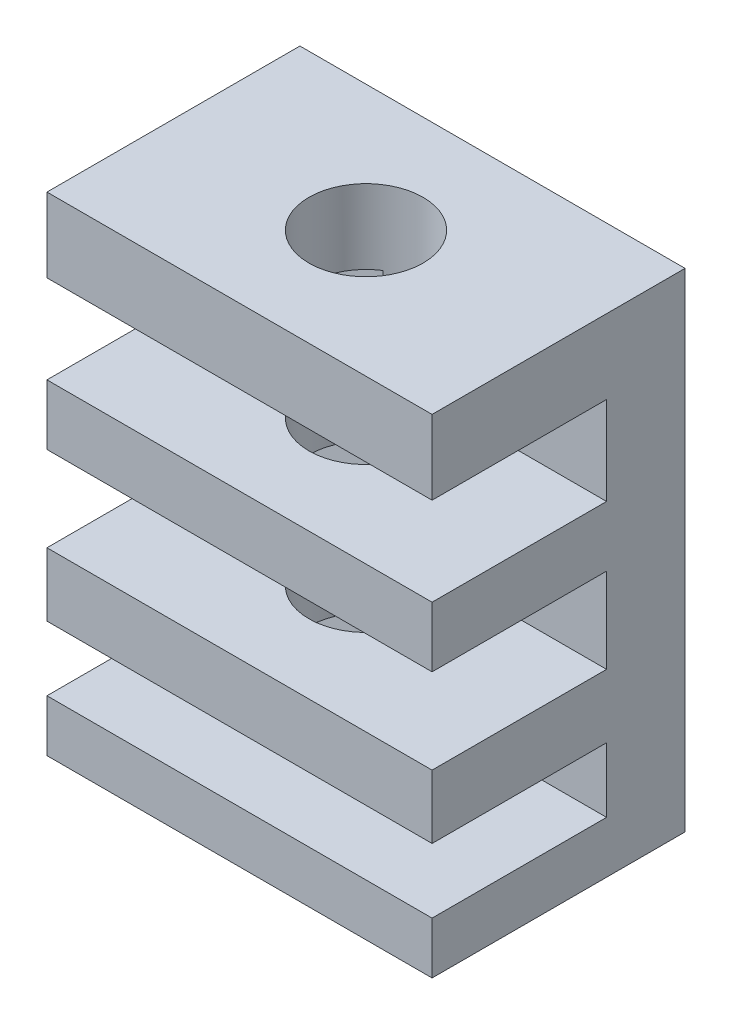
ISO-10303-21;
HEADER;
FILE_DESCRIPTION(('STEP AP214'),'2;1');
FILE_NAME('part.step','',(''),(''),'','','');
FILE_SCHEMA(('AUTOMOTIVE_DESIGN { 1 0 10303 214 1 1 1 1 }'));
ENDSEC;
DATA;
#1=APPLICATION_CONTEXT('core data for automotive mechanical design processes');
#2=APPLICATION_PROTOCOL_DEFINITION('international standard','automotive_design',2000,#1);
#3=PRODUCT_CONTEXT('',#1,'mechanical');
#4=PRODUCT('Part','Part','',(#3));
#5=PRODUCT_RELATED_PRODUCT_CATEGORY('part','',(#4));
#6=PRODUCT_DEFINITION_FORMATION('','',#4);
#7=PRODUCT_DEFINITION_CONTEXT('part definition',#1,'design');
#8=PRODUCT_DEFINITION('design','',#6,#7);
#9=PRODUCT_DEFINITION_SHAPE('','',#8);
#10=(LENGTH_UNIT() NAMED_UNIT(*) SI_UNIT(.MILLI.,.METRE.));
#11=(NAMED_UNIT(*) PLANE_ANGLE_UNIT() SI_UNIT($,.RADIAN.));
#12=(NAMED_UNIT(*) SI_UNIT($,.STERADIAN.) SOLID_ANGLE_UNIT());
#13=UNCERTAINTY_MEASURE_WITH_UNIT(LENGTH_MEASURE(1.E-05),#10,'distance_accuracy_value','');
#14=(GEOMETRIC_REPRESENTATION_CONTEXT(3) GLOBAL_UNCERTAINTY_ASSIGNED_CONTEXT((#13)) GLOBAL_UNIT_ASSIGNED_CONTEXT((#10,
#11,#12)) REPRESENTATION_CONTEXT('',''));
#15=CARTESIAN_POINT('',(0.,0.,0.));
#16=DIRECTION('',(0.,0.,1.));
#17=DIRECTION('',(1.,0.,0.));
#18=AXIS2_PLACEMENT_3D('',#15,#16,#17);
#19=CARTESIAN_POINT('',(20.,21.4882723581472,4.07517189736783));
#20=DIRECTION('',(0.,0.,-1.));
#21=DIRECTION('',(-1.,0.,0.));
#22=AXIS2_PLACEMENT_3D('',#19,#20,#21);
#23=PLANE('',#22);
#24=DIRECTION('',(-1.,0.,0.));
#25=VECTOR('',#24,1.);
#26=CARTESIAN_POINT('',(20.,16.9015751979846,4.07517189736783));
#27=LINE('',#26,#25);
#28=CARTESIAN_POINT('',(8.40046132815094,16.9015751979846,4.07517189736783));
#29=VERTEX_POINT('',#28);
#30=CARTESIAN_POINT('',(0.,16.9015751979846,4.07517189736783));
#31=VERTEX_POINT('',#30);
#32=EDGE_CURVE('E232',#29,#31,#27,.T.);
#33=ORIENTED_EDGE('',*,*,#32,.F.);
#34=DIRECTION('',(0.,1.,0.));
#35=VECTOR('',#34,1.);
#36=CARTESIAN_POINT('',(8.40046132815094,0.,4.07517189736783));
#37=LINE('',#36,#35);
#38=CARTESIAN_POINT('',(8.40046132815094,21.4882723581472,4.07517189736783));
#39=VERTEX_POINT('',#38);
#40=EDGE_CURVE('E48',#29,#39,#37,.T.);
#41=ORIENTED_EDGE('',*,*,#40,.T.);
#42=DIRECTION('',(-1.,0.,0.));
#43=VECTOR('',#42,1.);
#44=CARTESIAN_POINT('',(20.,21.4882723581472,4.07517189736783));
#45=LINE('',#44,#43);
#46=CARTESIAN_POINT('',(0.,21.4882723581472,4.07517189736783));
#47=VERTEX_POINT('',#46);
#48=EDGE_CURVE('E236',#39,#47,#45,.T.);
#49=ORIENTED_EDGE('',*,*,#48,.T.);
#50=DIRECTION('',(0.,-1.,0.));
#51=VECTOR('',#50,1.);
#52=CARTESIAN_POINT('',(0.,21.4882723581472,4.07517189736783));
#53=LINE('',#52,#51);
#54=EDGE_CURVE('E283',#47,#31,#53,.T.);
#55=ORIENTED_EDGE('',*,*,#54,.T.);
#56=EDGE_LOOP('',(#33,#41,#49,#55));
#57=FACE_BOUND('',#56,.T.);
#58=ADVANCED_FACE('F33',(#57),#23,.F.);
#59=CARTESIAN_POINT('',(20.,13.7691966495809,4.07517189736783));
#60=DIRECTION('',(0.,0.,-1.));
#61=DIRECTION('',(-1.,0.,0.));
#62=AXIS2_PLACEMENT_3D('',#59,#60,#61);
#63=PLANE('',#62);
#64=DIRECTION('',(-1.,0.,0.));
#65=VECTOR('',#64,1.);
#66=CARTESIAN_POINT('',(20.,9.35030548308285,4.07517189736783));
#67=LINE('',#66,#65);
#68=CARTESIAN_POINT('',(8.40046132815094,9.35030548308285,4.07517189736783));
#69=VERTEX_POINT('',#68);
#70=CARTESIAN_POINT('',(0.,9.35030548308285,4.07517189736783));
#71=VERTEX_POINT('',#70);
#72=EDGE_CURVE('E218',#69,#71,#67,.T.);
#73=ORIENTED_EDGE('',*,*,#72,.F.);
#74=DIRECTION('',(0.,1.,0.));
#75=VECTOR('',#74,1.);
#76=CARTESIAN_POINT('',(8.40046132815094,0.,4.07517189736783));
#77=LINE('',#76,#75);
#78=CARTESIAN_POINT('',(8.40046132815094,13.7691966495809,4.07517189736783));
#79=VERTEX_POINT('',#78);
#80=EDGE_CURVE('E56',#69,#79,#77,.T.);
#81=ORIENTED_EDGE('',*,*,#80,.T.);
#82=DIRECTION('',(-1.,0.,0.));
#83=VECTOR('',#82,1.);
#84=CARTESIAN_POINT('',(20.,13.7691966495809,4.07517189736783));
#85=LINE('',#84,#83);
#86=CARTESIAN_POINT('',(0.,13.7691966495809,4.07517189736783));
#87=VERTEX_POINT('',#86);
#88=EDGE_CURVE('E222',#79,#87,#85,.T.);
#89=ORIENTED_EDGE('',*,*,#88,.T.);
#90=DIRECTION('',(0.,-1.,0.));
#91=VECTOR('',#90,1.);
#92=CARTESIAN_POINT('',(0.,13.7691966495809,4.07517189736783));
#93=LINE('',#92,#91);
#94=EDGE_CURVE('E293',#87,#71,#93,.T.);
#95=ORIENTED_EDGE('',*,*,#94,.T.);
#96=EDGE_LOOP('',(#73,#81,#89,#95));
#97=FACE_BOUND('',#96,.T.);
#98=ADVANCED_FACE('F442',(#97),#63,.F.);
#99=CARTESIAN_POINT('',(20.,6.05012094101468,4.07517189736783));
#100=DIRECTION('',(0.,0.,-1.));
#101=DIRECTION('',(-1.,0.,0.));
#102=AXIS2_PLACEMENT_3D('',#99,#100,#101);
#103=PLANE('',#102);
#104=DIRECTION('',(-1.,0.,0.));
#105=VECTOR('',#104,1.);
#106=CARTESIAN_POINT('',(20.,2.69400106772501,4.07517189736783));
#107=LINE('',#106,#105);
#108=CARTESIAN_POINT('',(8.40046132815094,2.69400106772501,4.07517189736783));
#109=VERTEX_POINT('',#108);
#110=CARTESIAN_POINT('',(0.,2.69400106772501,4.07517189736783));
#111=VERTEX_POINT('',#110);
#112=EDGE_CURVE('E205',#109,#111,#107,.T.);
#113=ORIENTED_EDGE('',*,*,#112,.F.);
#114=DIRECTION('',(0.,1.,0.));
#115=VECTOR('',#114,1.);
#116=CARTESIAN_POINT('',(8.40046132815094,0.,4.07517189736783));
#117=LINE('',#116,#115);
#118=CARTESIAN_POINT('',(8.40046132815094,6.05012094101468,4.07517189736783));
#119=VERTEX_POINT('',#118);
#120=EDGE_CURVE('E186',#109,#119,#117,.T.);
#121=ORIENTED_EDGE('',*,*,#120,.T.);
#122=DIRECTION('',(-1.,0.,0.));
#123=VECTOR('',#122,1.);
#124=CARTESIAN_POINT('',(20.,6.05012094101468,4.07517189736783));
#125=LINE('',#124,#123);
#126=CARTESIAN_POINT('',(0.,6.05012094101468,4.07517189736783));
#127=VERTEX_POINT('',#126);
#128=EDGE_CURVE('E204',#119,#127,#125,.T.);
#129=ORIENTED_EDGE('',*,*,#128,.T.);
#130=DIRECTION('',(0.,-1.,0.));
#131=VECTOR('',#130,1.);
#132=CARTESIAN_POINT('',(0.,6.05012094101468,4.07517189736783));
#133=LINE('',#132,#131);
#134=EDGE_CURVE('E303',#127,#111,#133,.T.);
#135=ORIENTED_EDGE('',*,*,#134,.T.);
#136=EDGE_LOOP('',(#113,#121,#129,#135));
#137=FACE_BOUND('',#136,.T.);
#138=ADVANCED_FACE('F427',(#137),#103,.F.);
#139=CARTESIAN_POINT('',(20.,0.,13.1366955552499));
#140=DIRECTION('',(0.,1.,0.));
#141=DIRECTION('',(0.,0.,1.));
#142=AXIS2_PLACEMENT_3D('',#139,#140,#141);
#143=PLANE('',#142);
#144=CARTESIAN_POINT('',(10.,0.,6.56834777762497));
#145=DIRECTION('',(0.,1.,0.));
#146=DIRECTION('',(0.,0.,1.));
#147=AXIS2_PLACEMENT_3D('',#144,#145,#146);
#148=CIRCLE('',#147,2.96216980145241);
#149=CARTESIAN_POINT('',(10.,0.,9.53051757907738));
#150=VERTEX_POINT('',#149);
#151=EDGE_CURVE('E199',#150,#150,#148,.T.);
#152=ORIENTED_EDGE('',*,*,#151,.T.);
#153=EDGE_LOOP('',(#152));
#154=FACE_BOUND('',#153,.T.);
#155=DIRECTION('',(0.,0.,-1.));
#156=VECTOR('',#155,1.);
#157=CARTESIAN_POINT('',(0.,0.,13.1366955552499));
#158=LINE('',#157,#156);
#159=CARTESIAN_POINT('',(0.,0.,13.1366955552499));
#160=VERTEX_POINT('',#159);
#161=CARTESIAN_POINT('',(0.,0.,0.));
#162=VERTEX_POINT('',#161);
#163=EDGE_CURVE('E261',#160,#162,#158,.T.);
#164=ORIENTED_EDGE('',*,*,#163,.T.);
#165=DIRECTION('',(-1.,0.,0.));
#166=VECTOR('',#165,1.);
#167=CARTESIAN_POINT('',(20.,0.,0.));
#168=LINE('',#167,#166);
#169=CARTESIAN_POINT('',(20.,0.,0.));
#170=VERTEX_POINT('',#169);
#171=EDGE_CURVE('E41',#170,#162,#168,.T.);
#172=ORIENTED_EDGE('',*,*,#171,.F.);
#173=DIRECTION('',(0.,0.,-1.));
#174=VECTOR('',#173,1.);
#175=CARTESIAN_POINT('',(20.,0.,13.1366955552499));
#176=LINE('',#175,#174);
#177=CARTESIAN_POINT('',(20.,0.,13.1366955552499));
#178=VERTEX_POINT('',#177);
#179=EDGE_CURVE('E309',#178,#170,#176,.T.);
#180=ORIENTED_EDGE('',*,*,#179,.F.);
#181=DIRECTION('',(-1.,0.,0.));
#182=VECTOR('',#181,1.);
#183=CARTESIAN_POINT('',(20.,0.,13.1366955552499));
#184=LINE('',#183,#182);
#185=EDGE_CURVE('E263',#178,#160,#184,.T.);
#186=ORIENTED_EDGE('',*,*,#185,.T.);
#187=EDGE_LOOP('',(#164,#172,#180,#186));
#188=FACE_BOUND('',#187,.T.);
#189=ADVANCED_FACE('F35',(#154,#188),#143,.F.);
#190=CARTESIAN_POINT('',(20.,0.,0.));
#191=DIRECTION('',(0.,0.,1.));
#192=DIRECTION('',(1.,0.,0.));
#193=AXIS2_PLACEMENT_3D('',#190,#191,#192);
#194=PLANE('',#193);
#195=DIRECTION('',(0.,1.,0.));
#196=VECTOR('',#195,1.);
#197=CARTESIAN_POINT('',(0.,0.,0.));
#198=LINE('',#197,#196);
#199=CARTESIAN_POINT('',(0.,25.3478102124303,0.));
#200=VERTEX_POINT('',#199);
#201=EDGE_CURVE('E254',#162,#200,#198,.T.);
#202=ORIENTED_EDGE('',*,*,#201,.T.);
#203=DIRECTION('',(-1.,0.,0.));
#204=VECTOR('',#203,1.);
#205=CARTESIAN_POINT('',(20.,25.3478102124303,0.));
#206=LINE('',#205,#204);
#207=CARTESIAN_POINT('',(20.,25.3478102124303,0.));
#208=VERTEX_POINT('',#207);
#209=EDGE_CURVE('E246',#208,#200,#206,.T.);
#210=ORIENTED_EDGE('',*,*,#209,.F.);
#211=DIRECTION('',(0.,1.,0.));
#212=VECTOR('',#211,1.);
#213=CARTESIAN_POINT('',(20.,0.,0.));
#214=LINE('',#213,#212);
#215=EDGE_CURVE('E255',#170,#208,#214,.T.);
#216=ORIENTED_EDGE('',*,*,#215,.F.);
#217=ORIENTED_EDGE('',*,*,#171,.T.);
#218=EDGE_LOOP('',(#202,#210,#216,#217));
#219=FACE_BOUND('',#218,.T.);
#220=ADVANCED_FACE('F252',(#219),#194,.F.);
#221=CARTESIAN_POINT('',(20.,25.3478102124303,0.));
#222=DIRECTION('',(0.,-1.,0.));
#223=DIRECTION('',(0.,0.,-1.));
#224=AXIS2_PLACEMENT_3D('',#221,#222,#223);
#225=PLANE('',#224);
#226=CARTESIAN_POINT('',(10.,25.3478102124303,6.56834777762497));
#227=DIRECTION('',(0.,-1.,0.));
#228=DIRECTION('',(0.,0.,-1.));
#229=AXIS2_PLACEMENT_3D('',#226,#227,#228);
#230=CIRCLE('',#229,2.96216980145241);
#231=CARTESIAN_POINT('',(10.,25.3478102124303,3.60617797617256));
#232=VERTEX_POINT('',#231);
#233=EDGE_CURVE('E266',#232,#232,#230,.T.);
#234=ORIENTED_EDGE('',*,*,#233,.T.);
#235=EDGE_LOOP('',(#234));
#236=FACE_BOUND('',#235,.T.);
#237=DIRECTION('',(0.,0.,1.));
#238=VECTOR('',#237,1.);
#239=CARTESIAN_POINT('',(0.,25.3478102124303,0.));
#240=LINE('',#239,#238);
#241=CARTESIAN_POINT('',(0.,25.3478102124303,13.1366955552499));
#242=VERTEX_POINT('',#241);
#243=EDGE_CURVE('E268',#200,#242,#240,.T.);
#244=ORIENTED_EDGE('',*,*,#243,.T.);
#245=DIRECTION('',(-1.,0.,0.));
#246=VECTOR('',#245,1.);
#247=CARTESIAN_POINT('',(20.,25.3478102124303,13.1366955552499));
#248=LINE('',#247,#246);
#249=CARTESIAN_POINT('',(20.,25.3478102124303,13.1366955552499));
#250=VERTEX_POINT('',#249);
#251=EDGE_CURVE('E243',#250,#242,#248,.T.);
#252=ORIENTED_EDGE('',*,*,#251,.F.);
#253=DIRECTION('',(0.,0.,1.));
#254=VECTOR('',#253,1.);
#255=CARTESIAN_POINT('',(20.,25.3478102124303,0.));
#256=LINE('',#255,#254);
#257=EDGE_CURVE('E336',#208,#250,#256,.T.);
#258=ORIENTED_EDGE('',*,*,#257,.F.);
#259=ORIENTED_EDGE('',*,*,#209,.T.);
#260=EDGE_LOOP('',(#244,#252,#258,#259));
#261=FACE_BOUND('',#260,.T.);
#262=ADVANCED_FACE('F369',(#236,#261),#225,.F.);
#263=CARTESIAN_POINT('',(20.,25.3478102124303,13.1366955552499));
#264=DIRECTION('',(0.,0.,-1.));
#265=DIRECTION('',(-1.,0.,0.));
#266=AXIS2_PLACEMENT_3D('',#263,#264,#265);
#267=PLANE('',#266);
#268=DIRECTION('',(0.,-1.,0.));
#269=VECTOR('',#268,1.);
#270=CARTESIAN_POINT('',(0.,25.3478102124303,13.1366955552499));
#271=LINE('',#270,#269);
#272=CARTESIAN_POINT('',(0.,21.4882723581472,13.1366955552499));
#273=VERTEX_POINT('',#272);
#274=EDGE_CURVE('E278',#242,#273,#271,.T.);
#275=ORIENTED_EDGE('',*,*,#274,.T.);
#276=DIRECTION('',(-1.,0.,0.));
#277=VECTOR('',#276,1.);
#278=CARTESIAN_POINT('',(20.,21.4882723581472,13.1366955552499));
#279=LINE('',#278,#277);
#280=CARTESIAN_POINT('',(20.,21.4882723581472,13.1366955552499));
#281=VERTEX_POINT('',#280);
#282=EDGE_CURVE('E240',#281,#273,#279,.T.);
#283=ORIENTED_EDGE('',*,*,#282,.F.);
#284=DIRECTION('',(0.,-1.,0.));
#285=VECTOR('',#284,1.);
#286=CARTESIAN_POINT('',(20.,25.3478102124303,13.1366955552499));
#287=LINE('',#286,#285);
#288=EDGE_CURVE('E334',#250,#281,#287,.T.);
#289=ORIENTED_EDGE('',*,*,#288,.F.);
#290=ORIENTED_EDGE('',*,*,#251,.T.);
#291=EDGE_LOOP('',(#275,#283,#289,#290));
#292=FACE_BOUND('',#291,.T.);
#293=ADVANCED_FACE('F372',(#292),#267,.F.);
#294=CARTESIAN_POINT('',(20.,21.4882723581472,13.1366955552499));
#295=DIRECTION('',(0.,1.,0.));
#296=DIRECTION('',(0.,0.,1.));
#297=AXIS2_PLACEMENT_3D('',#294,#295,#296);
#298=PLANE('',#297);
#299=ORIENTED_EDGE('',*,*,#48,.F.);
#300=CARTESIAN_POINT('',(10.,21.4882723581472,6.56834777762497));
#301=DIRECTION('',(0.,1.,0.));
#302=DIRECTION('',(0.,0.,1.));
#303=AXIS2_PLACEMENT_3D('',#300,#301,#302);
#304=CIRCLE('',#303,2.96216980145241);
#305=CARTESIAN_POINT('',(11.5995386718491,21.4882723581472,4.07517189736783));
#306=VERTEX_POINT('',#305);
#307=EDGE_CURVE('E271',#39,#306,#304,.T.);
#308=ORIENTED_EDGE('',*,*,#307,.T.);
#309=CARTESIAN_POINT('',(20.,21.4882723581472,4.07517189736783));
#310=VERTEX_POINT('',#309);
#311=EDGE_CURVE('E237',#310,#306,#45,.T.);
#312=ORIENTED_EDGE('',*,*,#311,.F.);
#313=DIRECTION('',(0.,0.,-1.));
#314=VECTOR('',#313,1.);
#315=CARTESIAN_POINT('',(20.,21.4882723581472,13.1366955552499));
#316=LINE('',#315,#314);
#317=EDGE_CURVE('E332',#281,#310,#316,.T.);
#318=ORIENTED_EDGE('',*,*,#317,.F.);
#319=ORIENTED_EDGE('',*,*,#282,.T.);
#320=DIRECTION('',(0.,0.,-1.));
#321=VECTOR('',#320,1.);
#322=CARTESIAN_POINT('',(0.,21.4882723581472,13.1366955552499));
#323=LINE('',#322,#321);
#324=EDGE_CURVE('E280',#273,#47,#323,.T.);
#325=ORIENTED_EDGE('',*,*,#324,.T.);
#326=EDGE_LOOP('',(#299,#308,#312,#318,#319,#325));
#327=FACE_BOUND('',#326,.T.);
#328=ADVANCED_FACE('F386',(#327),#298,.F.);
#329=ORIENTED_EDGE('',*,*,#311,.T.);
#330=DIRECTION('',(0.,1.,0.));
#331=VECTOR('',#330,1.);
#332=CARTESIAN_POINT('',(11.5995386718491,0.,4.07517189736783));
#333=LINE('',#332,#331);
#334=CARTESIAN_POINT('',(11.5995386718491,16.9015751979846,4.07517189736783));
#335=VERTEX_POINT('',#334);
#336=EDGE_CURVE('E343',#306,#335,#333,.F.);
#337=ORIENTED_EDGE('',*,*,#336,.T.);
#338=CARTESIAN_POINT('',(20.,16.9015751979846,4.07517189736783));
#339=VERTEX_POINT('',#338);
#340=EDGE_CURVE('E233',#339,#335,#27,.T.);
#341=ORIENTED_EDGE('',*,*,#340,.F.);
#342=DIRECTION('',(0.,-1.,0.));
#343=VECTOR('',#342,1.);
#344=CARTESIAN_POINT('',(20.,21.4882723581472,4.07517189736783));
#345=LINE('',#344,#343);
#346=EDGE_CURVE('E330',#310,#339,#345,.T.);
#347=ORIENTED_EDGE('',*,*,#346,.F.);
#348=EDGE_LOOP('',(#329,#337,#341,#347));
#349=FACE_BOUND('',#348,.T.);
#350=ADVANCED_FACE('F395',(#349),#23,.F.);
#351=CARTESIAN_POINT('',(20.,16.9015751979846,4.07517189736783));
#352=DIRECTION('',(0.,-1.,0.));
#353=DIRECTION('',(0.,0.,-1.));
#354=AXIS2_PLACEMENT_3D('',#351,#352,#353);
#355=PLANE('',#354);
#356=ORIENTED_EDGE('',*,*,#340,.T.);
#357=CARTESIAN_POINT('',(10.,16.9015751979846,6.56834777762497));
#358=DIRECTION('',(0.,-1.,0.));
#359=DIRECTION('',(0.,0.,-1.));
#360=AXIS2_PLACEMENT_3D('',#357,#358,#359);
#361=CIRCLE('',#360,2.96216980145241);
#362=EDGE_CURVE('E346',#335,#29,#361,.T.);
#363=ORIENTED_EDGE('',*,*,#362,.T.);
#364=ORIENTED_EDGE('',*,*,#32,.T.);
#365=DIRECTION('',(0.,0.,1.));
#366=VECTOR('',#365,1.);
#367=CARTESIAN_POINT('',(0.,16.9015751979846,4.07517189736783));
#368=LINE('',#367,#366);
#369=CARTESIAN_POINT('',(0.,16.9015751979846,13.1366955552499));
#370=VERTEX_POINT('',#369);
#371=EDGE_CURVE('E286',#31,#370,#368,.T.);
#372=ORIENTED_EDGE('',*,*,#371,.T.);
#373=DIRECTION('',(-1.,0.,0.));
#374=VECTOR('',#373,1.);
#375=CARTESIAN_POINT('',(20.,16.9015751979846,13.1366955552499));
#376=LINE('',#375,#374);
#377=CARTESIAN_POINT('',(20.,16.9015751979846,13.1366955552499));
#378=VERTEX_POINT('',#377);
#379=EDGE_CURVE('E229',#378,#370,#376,.T.);
#380=ORIENTED_EDGE('',*,*,#379,.F.);
#381=DIRECTION('',(0.,0.,1.));
#382=VECTOR('',#381,1.);
#383=CARTESIAN_POINT('',(20.,16.9015751979846,4.07517189736783));
#384=LINE('',#383,#382);
#385=EDGE_CURVE('E328',#339,#378,#384,.T.);
#386=ORIENTED_EDGE('',*,*,#385,.F.);
#387=EDGE_LOOP('',(#356,#363,#364,#372,#380,#386));
#388=FACE_BOUND('',#387,.T.);
#389=ADVANCED_FACE('F397',(#388),#355,.F.);
#390=CARTESIAN_POINT('',(20.,16.9015751979846,13.1366955552499));
#391=DIRECTION('',(0.,0.,-1.));
#392=DIRECTION('',(-1.,0.,0.));
#393=AXIS2_PLACEMENT_3D('',#390,#391,#392);
#394=PLANE('',#393);
#395=DIRECTION('',(0.,-1.,0.));
#396=VECTOR('',#395,1.);
#397=CARTESIAN_POINT('',(0.,16.9015751979846,13.1366955552499));
#398=LINE('',#397,#396);
#399=CARTESIAN_POINT('',(0.,13.7691966495809,13.1366955552499));
#400=VERTEX_POINT('',#399);
#401=EDGE_CURVE('E288',#370,#400,#398,.T.);
#402=ORIENTED_EDGE('',*,*,#401,.T.);
#403=DIRECTION('',(-1.,0.,0.));
#404=VECTOR('',#403,1.);
#405=CARTESIAN_POINT('',(20.,13.7691966495809,13.1366955552499));
#406=LINE('',#405,#404);
#407=CARTESIAN_POINT('',(20.,13.7691966495809,13.1366955552499));
#408=VERTEX_POINT('',#407);
#409=EDGE_CURVE('E226',#408,#400,#406,.T.);
#410=ORIENTED_EDGE('',*,*,#409,.F.);
#411=DIRECTION('',(0.,-1.,0.));
#412=VECTOR('',#411,1.);
#413=CARTESIAN_POINT('',(20.,16.9015751979846,13.1366955552499));
#414=LINE('',#413,#412);
#415=EDGE_CURVE('E326',#378,#408,#414,.T.);
#416=ORIENTED_EDGE('',*,*,#415,.F.);
#417=ORIENTED_EDGE('',*,*,#379,.T.);
#418=EDGE_LOOP('',(#402,#410,#416,#417));
#419=FACE_BOUND('',#418,.T.);
#420=ADVANCED_FACE('F402',(#419),#394,.F.);
#421=CARTESIAN_POINT('',(20.,13.7691966495809,13.1366955552499));
#422=DIRECTION('',(0.,1.,0.));
#423=DIRECTION('',(0.,0.,1.));
#424=AXIS2_PLACEMENT_3D('',#421,#422,#423);
#425=PLANE('',#424);
#426=ORIENTED_EDGE('',*,*,#88,.F.);
#427=CARTESIAN_POINT('',(10.,13.7691966495809,6.56834777762497));
#428=DIRECTION('',(0.,1.,0.));
#429=DIRECTION('',(0.,0.,1.));
#430=AXIS2_PLACEMENT_3D('',#427,#428,#429);
#431=CIRCLE('',#430,2.96216980145241);
#432=CARTESIAN_POINT('',(11.5995386718491,13.7691966495809,4.07517189736783));
#433=VERTEX_POINT('',#432);
#434=EDGE_CURVE('E348',#79,#433,#431,.T.);
#435=ORIENTED_EDGE('',*,*,#434,.T.);
#436=CARTESIAN_POINT('',(20.,13.7691966495809,4.07517189736783));
#437=VERTEX_POINT('',#436);
#438=EDGE_CURVE('E223',#437,#433,#85,.T.);
#439=ORIENTED_EDGE('',*,*,#438,.F.);
#440=DIRECTION('',(0.,0.,-1.));
#441=VECTOR('',#440,1.);
#442=CARTESIAN_POINT('',(20.,13.7691966495809,13.1366955552499));
#443=LINE('',#442,#441);
#444=EDGE_CURVE('E324',#408,#437,#443,.T.);
#445=ORIENTED_EDGE('',*,*,#444,.F.);
#446=ORIENTED_EDGE('',*,*,#409,.T.);
#447=DIRECTION('',(0.,0.,-1.));
#448=VECTOR('',#447,1.);
#449=CARTESIAN_POINT('',(0.,13.7691966495809,13.1366955552499));
#450=LINE('',#449,#448);
#451=EDGE_CURVE('E290',#400,#87,#450,.T.);
#452=ORIENTED_EDGE('',*,*,#451,.T.);
#453=EDGE_LOOP('',(#426,#435,#439,#445,#446,#452));
#454=FACE_BOUND('',#453,.T.);
#455=ADVANCED_FACE('F409',(#454),#425,.F.);
#456=ORIENTED_EDGE('',*,*,#438,.T.);
#457=DIRECTION('',(0.,1.,0.));
#458=VECTOR('',#457,1.);
#459=CARTESIAN_POINT('',(11.5995386718491,0.,4.07517189736783));
#460=LINE('',#459,#458);
#461=CARTESIAN_POINT('',(11.5995386718491,9.35030548308285,4.07517189736783));
#462=VERTEX_POINT('',#461);
#463=EDGE_CURVE('E352',#433,#462,#460,.F.);
#464=ORIENTED_EDGE('',*,*,#463,.T.);
#465=CARTESIAN_POINT('',(20.,9.35030548308285,4.07517189736783));
#466=VERTEX_POINT('',#465);
#467=EDGE_CURVE('E219',#466,#462,#67,.T.);
#468=ORIENTED_EDGE('',*,*,#467,.F.);
#469=DIRECTION('',(0.,-1.,0.));
#470=VECTOR('',#469,1.);
#471=CARTESIAN_POINT('',(20.,13.7691966495809,4.07517189736783));
#472=LINE('',#471,#470);
#473=EDGE_CURVE('E322',#437,#466,#472,.T.);
#474=ORIENTED_EDGE('',*,*,#473,.F.);
#475=EDGE_LOOP('',(#456,#464,#468,#474));
#476=FACE_BOUND('',#475,.T.);
#477=ADVANCED_FACE('F411',(#476),#63,.F.);
#478=CARTESIAN_POINT('',(20.,9.35030548308285,4.07517189736783));
#479=DIRECTION('',(0.,-1.,0.));
#480=DIRECTION('',(0.,0.,-1.));
#481=AXIS2_PLACEMENT_3D('',#478,#479,#480);
#482=PLANE('',#481);
#483=ORIENTED_EDGE('',*,*,#467,.T.);
#484=CARTESIAN_POINT('',(10.,9.35030548308285,6.56834777762497));
#485=DIRECTION('',(0.,-1.,0.));
#486=DIRECTION('',(0.,0.,-1.));
#487=AXIS2_PLACEMENT_3D('',#484,#485,#486);
#488=CIRCLE('',#487,2.96216980145241);
#489=EDGE_CURVE('E355',#462,#69,#488,.T.);
#490=ORIENTED_EDGE('',*,*,#489,.T.);
#491=ORIENTED_EDGE('',*,*,#72,.T.);
#492=DIRECTION('',(0.,0.,1.));
#493=VECTOR('',#492,1.);
#494=CARTESIAN_POINT('',(0.,9.35030548308285,4.07517189736783));
#495=LINE('',#494,#493);
#496=CARTESIAN_POINT('',(0.,9.35030548308285,13.1366955552499));
#497=VERTEX_POINT('',#496);
#498=EDGE_CURVE('E296',#71,#497,#495,.T.);
#499=ORIENTED_EDGE('',*,*,#498,.T.);
#500=DIRECTION('',(-1.,0.,0.));
#501=VECTOR('',#500,1.);
#502=CARTESIAN_POINT('',(20.,9.35030548308285,13.1366955552499));
#503=LINE('',#502,#501);
#504=CARTESIAN_POINT('',(20.,9.35030548308285,13.1366955552499));
#505=VERTEX_POINT('',#504);
#506=EDGE_CURVE('E215',#505,#497,#503,.T.);
#507=ORIENTED_EDGE('',*,*,#506,.F.);
#508=DIRECTION('',(0.,0.,1.));
#509=VECTOR('',#508,1.);
#510=CARTESIAN_POINT('',(20.,9.35030548308285,4.07517189736783));
#511=LINE('',#510,#509);
#512=EDGE_CURVE('E320',#466,#505,#511,.T.);
#513=ORIENTED_EDGE('',*,*,#512,.F.);
#514=EDGE_LOOP('',(#483,#490,#491,#499,#507,#513));
#515=FACE_BOUND('',#514,.T.);
#516=ADVANCED_FACE('F415',(#515),#482,.F.);
#517=CARTESIAN_POINT('',(20.,9.35030548308285,13.1366955552499));
#518=DIRECTION('',(0.,0.,-1.));
#519=DIRECTION('',(-1.,0.,0.));
#520=AXIS2_PLACEMENT_3D('',#517,#518,#519);
#521=PLANE('',#520);
#522=DIRECTION('',(0.,-1.,0.));
#523=VECTOR('',#522,1.);
#524=CARTESIAN_POINT('',(0.,9.35030548308285,13.1366955552499));
#525=LINE('',#524,#523);
#526=CARTESIAN_POINT('',(0.,6.05012094101468,13.1366955552499));
#527=VERTEX_POINT('',#526);
#528=EDGE_CURVE('E298',#497,#527,#525,.T.);
#529=ORIENTED_EDGE('',*,*,#528,.T.);
#530=DIRECTION('',(-1.,0.,0.));
#531=VECTOR('',#530,1.);
#532=CARTESIAN_POINT('',(20.,6.05012094101468,13.1366955552499));
#533=LINE('',#532,#531);
#534=CARTESIAN_POINT('',(20.,6.05012094101468,13.1366955552499));
#535=VERTEX_POINT('',#534);
#536=EDGE_CURVE('E212',#535,#527,#533,.T.);
#537=ORIENTED_EDGE('',*,*,#536,.F.);
#538=DIRECTION('',(0.,-1.,0.));
#539=VECTOR('',#538,1.);
#540=CARTESIAN_POINT('',(20.,9.35030548308285,13.1366955552499));
#541=LINE('',#540,#539);
#542=EDGE_CURVE('E318',#505,#535,#541,.T.);
#543=ORIENTED_EDGE('',*,*,#542,.F.);
#544=ORIENTED_EDGE('',*,*,#506,.T.);
#545=EDGE_LOOP('',(#529,#537,#543,#544));
#546=FACE_BOUND('',#545,.T.);
#547=ADVANCED_FACE('F420',(#546),#521,.F.);
#548=CARTESIAN_POINT('',(20.,6.05012094101468,13.1366955552499));
#549=DIRECTION('',(0.,1.,0.));
#550=DIRECTION('',(0.,0.,1.));
#551=AXIS2_PLACEMENT_3D('',#548,#549,#550);
#552=PLANE('',#551);
#553=ORIENTED_EDGE('',*,*,#128,.F.);
#554=CARTESIAN_POINT('',(10.,6.05012094101468,6.56834777762497));
#555=DIRECTION('',(0.,1.,0.));
#556=DIRECTION('',(0.,0.,1.));
#557=AXIS2_PLACEMENT_3D('',#554,#555,#556);
#558=CIRCLE('',#557,2.96216980145241);
#559=CARTESIAN_POINT('',(11.5995386718491,6.05012094101468,4.07517189736783));
#560=VERTEX_POINT('',#559);
#561=EDGE_CURVE('E357',#119,#560,#558,.T.);
#562=ORIENTED_EDGE('',*,*,#561,.T.);
#563=CARTESIAN_POINT('',(20.,6.05012094101468,4.07517189736783));
#564=VERTEX_POINT('',#563);
#565=EDGE_CURVE('E198',#564,#560,#125,.T.);
#566=ORIENTED_EDGE('',*,*,#565,.F.);
#567=DIRECTION('',(0.,0.,-1.));
#568=VECTOR('',#567,1.);
#569=CARTESIAN_POINT('',(20.,6.05012094101468,13.1366955552499));
#570=LINE('',#569,#568);
#571=EDGE_CURVE('E314',#535,#564,#570,.T.);
#572=ORIENTED_EDGE('',*,*,#571,.F.);
#573=ORIENTED_EDGE('',*,*,#536,.T.);
#574=DIRECTION('',(0.,0.,-1.));
#575=VECTOR('',#574,1.);
#576=CARTESIAN_POINT('',(0.,6.05012094101468,13.1366955552499));
#577=LINE('',#576,#575);
#578=EDGE_CURVE('E300',#527,#127,#577,.T.);
#579=ORIENTED_EDGE('',*,*,#578,.T.);
#580=EDGE_LOOP('',(#553,#562,#566,#572,#573,#579));
#581=FACE_BOUND('',#580,.T.);
#582=ADVANCED_FACE('F425',(#581),#552,.F.);
#583=ORIENTED_EDGE('',*,*,#565,.T.);
#584=DIRECTION('',(0.,1.,0.));
#585=VECTOR('',#584,1.);
#586=CARTESIAN_POINT('',(11.5995386718491,0.,4.07517189736783));
#587=LINE('',#586,#585);
#588=CARTESIAN_POINT('',(11.5995386718491,2.69400106772501,4.07517189736783));
#589=VERTEX_POINT('',#588);
#590=EDGE_CURVE('E183',#560,#589,#587,.F.);
#591=ORIENTED_EDGE('',*,*,#590,.T.);
#592=CARTESIAN_POINT('',(20.,2.69400106772501,4.07517189736783));
#593=VERTEX_POINT('',#592);
#594=EDGE_CURVE('E195',#593,#589,#107,.T.);
#595=ORIENTED_EDGE('',*,*,#594,.F.);
#596=DIRECTION('',(0.,-1.,0.));
#597=VECTOR('',#596,1.);
#598=CARTESIAN_POINT('',(20.,6.05012094101468,4.07517189736783));
#599=LINE('',#598,#597);
#600=EDGE_CURVE('E313',#564,#593,#599,.T.);
#601=ORIENTED_EDGE('',*,*,#600,.F.);
#602=EDGE_LOOP('',(#583,#591,#595,#601));
#603=FACE_BOUND('',#602,.T.);
#604=ADVANCED_FACE('F193',(#603),#103,.F.);
#605=CARTESIAN_POINT('',(20.,2.69400106772501,4.07517189736783));
#606=DIRECTION('',(0.,-1.,0.));
#607=DIRECTION('',(0.,0.,-1.));
#608=AXIS2_PLACEMENT_3D('',#605,#606,#607);
#609=PLANE('',#608);
#610=ORIENTED_EDGE('',*,*,#594,.T.);
#611=CARTESIAN_POINT('',(10.,2.69400106772501,6.56834777762497));
#612=DIRECTION('',(0.,-1.,0.));
#613=DIRECTION('',(0.,0.,-1.));
#614=AXIS2_PLACEMENT_3D('',#611,#612,#613);
#615=CIRCLE('',#614,2.96216980145241);
#616=EDGE_CURVE('E11',#589,#109,#615,.T.);
#617=ORIENTED_EDGE('',*,*,#616,.T.);
#618=ORIENTED_EDGE('',*,*,#112,.T.);
#619=DIRECTION('',(0.,0.,1.));
#620=VECTOR('',#619,1.);
#621=CARTESIAN_POINT('',(0.,2.69400106772501,4.07517189736783));
#622=LINE('',#621,#620);
#623=CARTESIAN_POINT('',(0.,2.69400106772501,13.1366955552499));
#624=VERTEX_POINT('',#623);
#625=EDGE_CURVE('E306',#111,#624,#622,.T.);
#626=ORIENTED_EDGE('',*,*,#625,.T.);
#627=DIRECTION('',(-1.,0.,0.));
#628=VECTOR('',#627,1.);
#629=CARTESIAN_POINT('',(20.,2.69400106772501,13.1366955552499));
#630=LINE('',#629,#628);
#631=CARTESIAN_POINT('',(20.,2.69400106772501,13.1366955552499));
#632=VERTEX_POINT('',#631);
#633=EDGE_CURVE('E208',#632,#624,#630,.T.);
#634=ORIENTED_EDGE('',*,*,#633,.F.);
#635=DIRECTION('',(0.,0.,1.));
#636=VECTOR('',#635,1.);
#637=CARTESIAN_POINT('',(20.,2.69400106772501,4.07517189736783));
#638=LINE('',#637,#636);
#639=EDGE_CURVE('E203',#593,#632,#638,.T.);
#640=ORIENTED_EDGE('',*,*,#639,.F.);
#641=EDGE_LOOP('',(#610,#617,#618,#626,#634,#640));
#642=FACE_BOUND('',#641,.T.);
#643=ADVANCED_FACE('F201',(#642),#609,.F.);
#644=CARTESIAN_POINT('',(20.,2.69400106772501,13.1366955552499));
#645=DIRECTION('',(0.,0.,-1.));
#646=DIRECTION('',(-1.,0.,0.));
#647=AXIS2_PLACEMENT_3D('',#644,#645,#646);
#648=PLANE('',#647);
#649=DIRECTION('',(0.,-1.,0.));
#650=VECTOR('',#649,1.);
#651=CARTESIAN_POINT('',(0.,2.69400106772501,13.1366955552499));
#652=LINE('',#651,#650);
#653=EDGE_CURVE('E308',#624,#160,#652,.T.);
#654=ORIENTED_EDGE('',*,*,#653,.T.);
#655=ORIENTED_EDGE('',*,*,#185,.F.);
#656=DIRECTION('',(0.,-1.,0.));
#657=VECTOR('',#656,1.);
#658=CARTESIAN_POINT('',(20.,2.69400106772501,13.1366955552499));
#659=LINE('',#658,#657);
#660=EDGE_CURVE('E274',#632,#178,#659,.T.);
#661=ORIENTED_EDGE('',*,*,#660,.F.);
#662=ORIENTED_EDGE('',*,*,#633,.T.);
#663=EDGE_LOOP('',(#654,#655,#661,#662));
#664=FACE_BOUND('',#663,.T.);
#665=ADVANCED_FACE('F431',(#664),#648,.F.);
#666=CARTESIAN_POINT('',(20.,0.,0.));
#667=DIRECTION('',(1.,0.,0.));
#668=DIRECTION('',(0.,0.,-1.));
#669=AXIS2_PLACEMENT_3D('',#666,#667,#668);
#670=PLANE('',#669);
#671=ORIENTED_EDGE('',*,*,#179,.T.);
#672=ORIENTED_EDGE('',*,*,#215,.T.);
#673=ORIENTED_EDGE('',*,*,#257,.T.);
#674=ORIENTED_EDGE('',*,*,#288,.T.);
#675=ORIENTED_EDGE('',*,*,#317,.T.);
#676=ORIENTED_EDGE('',*,*,#346,.T.);
#677=ORIENTED_EDGE('',*,*,#385,.T.);
#678=ORIENTED_EDGE('',*,*,#415,.T.);
#679=ORIENTED_EDGE('',*,*,#444,.T.);
#680=ORIENTED_EDGE('',*,*,#473,.T.);
#681=ORIENTED_EDGE('',*,*,#512,.T.);
#682=ORIENTED_EDGE('',*,*,#542,.T.);
#683=ORIENTED_EDGE('',*,*,#571,.T.);
#684=ORIENTED_EDGE('',*,*,#600,.T.);
#685=ORIENTED_EDGE('',*,*,#639,.T.);
#686=ORIENTED_EDGE('',*,*,#660,.T.);
#687=EDGE_LOOP('',(#671,#672,#673,#674,#675,#676,#677,#678,#679,#680,#681,#682,#683,#684,#685,#686));
#688=FACE_BOUND('',#687,.T.);
#689=ADVANCED_FACE('F390',(#688),#670,.T.);
#690=CARTESIAN_POINT('',(0.,0.,0.));
#691=DIRECTION('',(1.,0.,0.));
#692=DIRECTION('',(0.,0.,-1.));
#693=AXIS2_PLACEMENT_3D('',#690,#691,#692);
#694=PLANE('',#693);
#695=ORIENTED_EDGE('',*,*,#163,.F.);
#696=ORIENTED_EDGE('',*,*,#653,.F.);
#697=ORIENTED_EDGE('',*,*,#625,.F.);
#698=ORIENTED_EDGE('',*,*,#134,.F.);
#699=ORIENTED_EDGE('',*,*,#578,.F.);
#700=ORIENTED_EDGE('',*,*,#528,.F.);
#701=ORIENTED_EDGE('',*,*,#498,.F.);
#702=ORIENTED_EDGE('',*,*,#94,.F.);
#703=ORIENTED_EDGE('',*,*,#451,.F.);
#704=ORIENTED_EDGE('',*,*,#401,.F.);
#705=ORIENTED_EDGE('',*,*,#371,.F.);
#706=ORIENTED_EDGE('',*,*,#54,.F.);
#707=ORIENTED_EDGE('',*,*,#324,.F.);
#708=ORIENTED_EDGE('',*,*,#274,.F.);
#709=ORIENTED_EDGE('',*,*,#243,.F.);
#710=ORIENTED_EDGE('',*,*,#201,.F.);
#711=EDGE_LOOP('',(#695,#696,#697,#698,#699,#700,#701,#702,#703,#704,#705,#706,#707,#708,#709,#710));
#712=FACE_BOUND('',#711,.T.);
#713=ADVANCED_FACE('F365',(#712),#694,.F.);
#714=CARTESIAN_POINT('',(10.,0.,6.56834777762497));
#715=DIRECTION('',(0.,1.,0.));
#716=DIRECTION('',(0.,0.,1.));
#717=AXIS2_PLACEMENT_3D('',#714,#715,#716);
#718=CYLINDRICAL_SURFACE('',#717,2.96216980145241);
#719=ORIENTED_EDGE('',*,*,#40,.F.);
#720=ORIENTED_EDGE('',*,*,#362,.F.);
#721=ORIENTED_EDGE('',*,*,#336,.F.);
#722=ORIENTED_EDGE('',*,*,#307,.F.);
#723=EDGE_LOOP('',(#719,#720,#721,#722));
#724=FACE_BOUND('',#723,.T.);
#725=ORIENTED_EDGE('',*,*,#80,.F.);
#726=ORIENTED_EDGE('',*,*,#489,.F.);
#727=ORIENTED_EDGE('',*,*,#463,.F.);
#728=ORIENTED_EDGE('',*,*,#434,.F.);
#729=EDGE_LOOP('',(#725,#726,#727,#728));
#730=FACE_BOUND('',#729,.T.);
#731=ORIENTED_EDGE('',*,*,#120,.F.);
#732=ORIENTED_EDGE('',*,*,#616,.F.);
#733=ORIENTED_EDGE('',*,*,#590,.F.);
#734=ORIENTED_EDGE('',*,*,#561,.F.);
#735=EDGE_LOOP('',(#731,#732,#733,#734));
#736=FACE_BOUND('',#735,.T.);
#737=ORIENTED_EDGE('',*,*,#151,.F.);
#738=EDGE_LOOP('',(#737));
#739=FACE_BOUND('',#738,.T.);
#740=ORIENTED_EDGE('',*,*,#233,.F.);
#741=EDGE_LOOP('',(#740));
#742=FACE_BOUND('',#741,.T.);
#743=ADVANCED_FACE('F181',(#724,#730,#736,#739,#742),#718,.F.);
#744=CLOSED_SHELL('',(#58,#98,#138,#189,#220,#262,#293,#328,#350,#389,#420,#455,#477,#516,#547,
#582,#604,#643,#665,#689,#713,#743));
#745=MANIFOLD_SOLID_BREP('B2',#744);
#746=ADVANCED_BREP_SHAPE_REPRESENTATION('',(#18,#745),#14);
#747=SHAPE_DEFINITION_REPRESENTATION(#9,#746);
ENDSEC;
END-ISO-10303-21;
